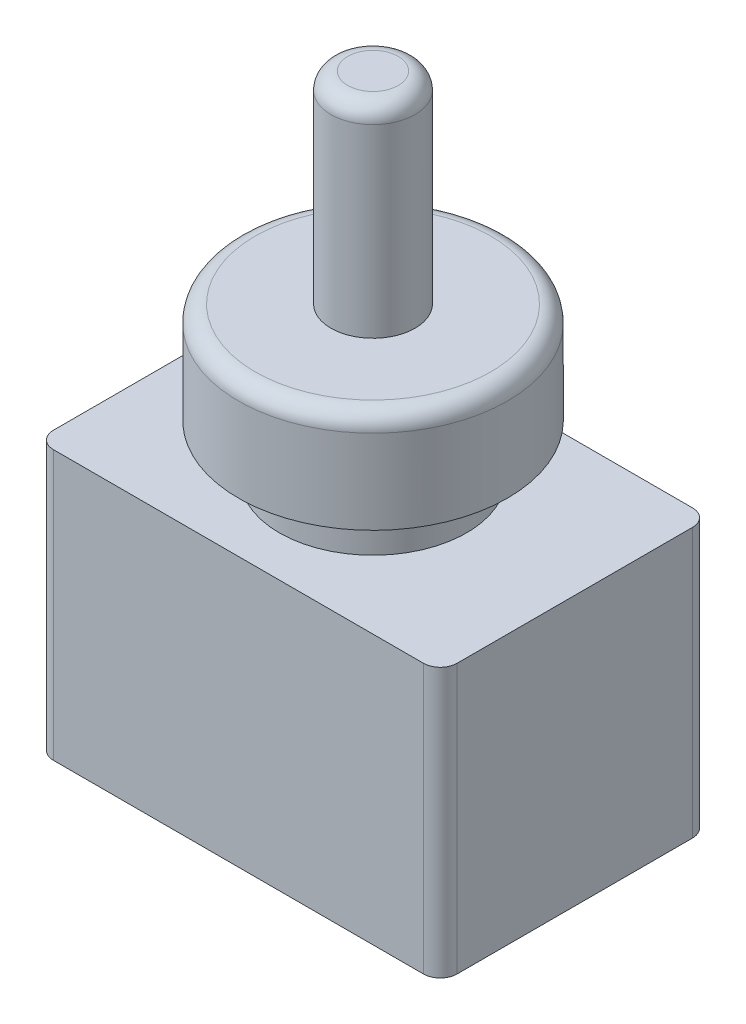
ISO-10303-21;
HEADER;
FILE_DESCRIPTION(('STEP AP214'),'2;1');
FILE_NAME('part.step','',(''),(''),'','','');
FILE_SCHEMA(('AUTOMOTIVE_DESIGN { 1 0 10303 214 1 1 1 1 }'));
ENDSEC;
DATA;
#1=APPLICATION_CONTEXT('core data for automotive mechanical design processes');
#2=APPLICATION_PROTOCOL_DEFINITION('international standard','automotive_design',2000,#1);
#3=PRODUCT_CONTEXT('',#1,'mechanical');
#4=PRODUCT('Part','Part','',(#3));
#5=PRODUCT_RELATED_PRODUCT_CATEGORY('part','',(#4));
#6=PRODUCT_DEFINITION_FORMATION('','',#4);
#7=PRODUCT_DEFINITION_CONTEXT('part definition',#1,'design');
#8=PRODUCT_DEFINITION('design','',#6,#7);
#9=PRODUCT_DEFINITION_SHAPE('','',#8);
#10=(LENGTH_UNIT() NAMED_UNIT(*) SI_UNIT(.MILLI.,.METRE.));
#11=(NAMED_UNIT(*) PLANE_ANGLE_UNIT() SI_UNIT($,.RADIAN.));
#12=(NAMED_UNIT(*) SI_UNIT($,.STERADIAN.) SOLID_ANGLE_UNIT());
#13=UNCERTAINTY_MEASURE_WITH_UNIT(LENGTH_MEASURE(1.E-05),#10,'distance_accuracy_value','');
#14=(GEOMETRIC_REPRESENTATION_CONTEXT(3) GLOBAL_UNCERTAINTY_ASSIGNED_CONTEXT((#13)) GLOBAL_UNIT_ASSIGNED_CONTEXT((#10,
#11,#12)) REPRESENTATION_CONTEXT('',''));
#15=CARTESIAN_POINT('',(0.,0.,0.));
#16=DIRECTION('',(0.,0.,1.));
#17=DIRECTION('',(1.,0.,0.));
#18=AXIS2_PLACEMENT_3D('',#15,#16,#17);
#19=CARTESIAN_POINT('',(12.,16.,8.));
#20=DIRECTION('',(0.,1.,0.));
#21=DIRECTION('',(0.,0.,1.));
#22=AXIS2_PLACEMENT_3D('',#19,#20,#21);
#23=PLANE('',#22);
#24=DIRECTION('',(1.,0.,0.));
#25=VECTOR('',#24,1.);
#26=CARTESIAN_POINT('',(-12.,16.,8.));
#27=LINE('',#26,#25);
#28=CARTESIAN_POINT('',(-11.,16.,8.));
#29=VERTEX_POINT('',#28);
#30=CARTESIAN_POINT('',(11.,16.,8.));
#31=VERTEX_POINT('',#30);
#32=EDGE_CURVE('E137',#29,#31,#27,.T.);
#33=ORIENTED_EDGE('',*,*,#32,.T.);
#34=CARTESIAN_POINT('',(11.,16.,7.));
#35=DIRECTION('',(0.,1.,0.));
#36=DIRECTION('',(0.,0.,1.));
#37=AXIS2_PLACEMENT_3D('',#34,#35,#36);
#38=CIRCLE('',#37,1.);
#39=CARTESIAN_POINT('',(12.,16.,7.));
#40=VERTEX_POINT('',#39);
#41=EDGE_CURVE('E168',#31,#40,#38,.T.);
#42=ORIENTED_EDGE('',*,*,#41,.T.);
#43=DIRECTION('',(0.,0.,-1.));
#44=VECTOR('',#43,1.);
#45=CARTESIAN_POINT('',(12.,16.,-8.));
#46=LINE('',#45,#44);
#47=CARTESIAN_POINT('',(12.,16.,-7.));
#48=VERTEX_POINT('',#47);
#49=EDGE_CURVE('E121',#40,#48,#46,.T.);
#50=ORIENTED_EDGE('',*,*,#49,.T.);
#51=CARTESIAN_POINT('',(11.,16.,-7.));
#52=DIRECTION('',(0.,1.,0.));
#53=DIRECTION('',(0.,0.,1.));
#54=AXIS2_PLACEMENT_3D('',#51,#52,#53);
#55=CIRCLE('',#54,1.);
#56=CARTESIAN_POINT('',(11.,16.,-8.));
#57=VERTEX_POINT('',#56);
#58=EDGE_CURVE('E166',#48,#57,#55,.T.);
#59=ORIENTED_EDGE('',*,*,#58,.T.);
#60=DIRECTION('',(-1.,0.,0.));
#61=VECTOR('',#60,1.);
#62=CARTESIAN_POINT('',(-12.,16.,-8.));
#63=LINE('',#62,#61);
#64=CARTESIAN_POINT('',(-11.,16.,-8.));
#65=VERTEX_POINT('',#64);
#66=EDGE_CURVE('E179',#57,#65,#63,.T.);
#67=ORIENTED_EDGE('',*,*,#66,.T.);
#68=CARTESIAN_POINT('',(-11.,16.,-7.));
#69=DIRECTION('',(0.,1.,0.));
#70=DIRECTION('',(0.,0.,1.));
#71=AXIS2_PLACEMENT_3D('',#68,#69,#70);
#72=CIRCLE('',#71,1.);
#73=CARTESIAN_POINT('',(-12.,16.,-7.));
#74=VERTEX_POINT('',#73);
#75=EDGE_CURVE('E56',#65,#74,#72,.T.);
#76=ORIENTED_EDGE('',*,*,#75,.T.);
#77=DIRECTION('',(0.,0.,1.));
#78=VECTOR('',#77,1.);
#79=CARTESIAN_POINT('',(-12.,16.,-8.));
#80=LINE('',#79,#78);
#81=CARTESIAN_POINT('',(-12.,16.,7.));
#82=VERTEX_POINT('',#81);
#83=EDGE_CURVE('E187',#74,#82,#80,.T.);
#84=ORIENTED_EDGE('',*,*,#83,.T.);
#85=CARTESIAN_POINT('',(-11.,16.,7.));
#86=DIRECTION('',(0.,1.,0.));
#87=DIRECTION('',(0.,0.,1.));
#88=AXIS2_PLACEMENT_3D('',#85,#86,#87);
#89=CIRCLE('',#88,1.);
#90=EDGE_CURVE('E163',#82,#29,#89,.T.);
#91=ORIENTED_EDGE('',*,*,#90,.T.);
#92=EDGE_LOOP('',(#33,#42,#50,#59,#67,#76,#84,#91));
#93=FACE_BOUND('',#92,.T.);
#94=CARTESIAN_POINT('',(0.,16.,0.));
#95=DIRECTION('',(0.,1.,0.));
#96=DIRECTION('',(0.,0.,1.));
#97=AXIS2_PLACEMENT_3D('',#94,#95,#96);
#98=CIRCLE('',#97,5.57185663947555);
#99=CARTESIAN_POINT('',(0.,16.,5.57185663947555));
#100=VERTEX_POINT('',#99);
#101=EDGE_CURVE('E134',#100,#100,#98,.T.);
#102=ORIENTED_EDGE('',*,*,#101,.F.);
#103=EDGE_LOOP('',(#102));
#104=FACE_BOUND('',#103,.T.);
#105=ADVANCED_FACE('F35',(#93,#104),#23,.T.);
#106=CARTESIAN_POINT('',(12.,16.,-8.));
#107=DIRECTION('',(-1.,0.,0.));
#108=DIRECTION('',(0.,0.,1.));
#109=AXIS2_PLACEMENT_3D('',#106,#107,#108);
#110=PLANE('',#109);
#111=ORIENTED_EDGE('',*,*,#49,.F.);
#112=DIRECTION('',(0.,-1.,0.));
#113=VECTOR('',#112,1.);
#114=CARTESIAN_POINT('',(12.,16.,7.));
#115=LINE('',#114,#113);
#116=CARTESIAN_POINT('',(12.,0.,7.));
#117=VERTEX_POINT('',#116);
#118=EDGE_CURVE('E105',#40,#117,#115,.T.);
#119=ORIENTED_EDGE('',*,*,#118,.T.);
#120=DIRECTION('',(0.,0.,-1.));
#121=VECTOR('',#120,1.);
#122=CARTESIAN_POINT('',(12.,0.,-8.));
#123=LINE('',#122,#121);
#124=CARTESIAN_POINT('',(12.,0.,-7.));
#125=VERTEX_POINT('',#124);
#126=EDGE_CURVE('E118',#117,#125,#123,.T.);
#127=ORIENTED_EDGE('',*,*,#126,.T.);
#128=DIRECTION('',(0.,-1.,0.));
#129=VECTOR('',#128,1.);
#130=CARTESIAN_POINT('',(12.,16.,-7.));
#131=LINE('',#130,#129);
#132=EDGE_CURVE('E123',#125,#48,#131,.F.);
#133=ORIENTED_EDGE('',*,*,#132,.T.);
#134=EDGE_LOOP('',(#111,#119,#127,#133));
#135=FACE_BOUND('',#134,.T.);
#136=ADVANCED_FACE('F117',(#135),#110,.F.);
#137=CARTESIAN_POINT('',(-12.,16.,-8.));
#138=DIRECTION('',(0.,0.,1.));
#139=DIRECTION('',(1.,0.,0.));
#140=AXIS2_PLACEMENT_3D('',#137,#138,#139);
#141=PLANE('',#140);
#142=ORIENTED_EDGE('',*,*,#66,.F.);
#143=DIRECTION('',(0.,-1.,0.));
#144=VECTOR('',#143,1.);
#145=CARTESIAN_POINT('',(11.,16.,-8.));
#146=LINE('',#145,#144);
#147=CARTESIAN_POINT('',(11.,0.,-8.));
#148=VERTEX_POINT('',#147);
#149=EDGE_CURVE('E172',#57,#148,#146,.T.);
#150=ORIENTED_EDGE('',*,*,#149,.T.);
#151=DIRECTION('',(-1.,0.,0.));
#152=VECTOR('',#151,1.);
#153=CARTESIAN_POINT('',(-12.,0.,-8.));
#154=LINE('',#153,#152);
#155=CARTESIAN_POINT('',(-11.,0.,-8.));
#156=VERTEX_POINT('',#155);
#157=EDGE_CURVE('E127',#148,#156,#154,.T.);
#158=ORIENTED_EDGE('',*,*,#157,.T.);
#159=DIRECTION('',(0.,-1.,0.));
#160=VECTOR('',#159,1.);
#161=CARTESIAN_POINT('',(-11.,16.,-8.));
#162=LINE('',#161,#160);
#163=EDGE_CURVE('E170',#156,#65,#162,.F.);
#164=ORIENTED_EDGE('',*,*,#163,.T.);
#165=EDGE_LOOP('',(#142,#150,#158,#164));
#166=FACE_BOUND('',#165,.T.);
#167=ADVANCED_FACE('F177',(#166),#141,.F.);
#168=CARTESIAN_POINT('',(-12.,16.,-8.));
#169=DIRECTION('',(1.,0.,0.));
#170=DIRECTION('',(0.,0.,-1.));
#171=AXIS2_PLACEMENT_3D('',#168,#169,#170);
#172=PLANE('',#171);
#173=ORIENTED_EDGE('',*,*,#83,.F.);
#174=DIRECTION('',(0.,-1.,0.));
#175=VECTOR('',#174,1.);
#176=CARTESIAN_POINT('',(-12.,16.,-7.));
#177=LINE('',#176,#175);
#178=CARTESIAN_POINT('',(-12.,0.,-7.));
#179=VERTEX_POINT('',#178);
#180=EDGE_CURVE('E11',#74,#179,#177,.T.);
#181=ORIENTED_EDGE('',*,*,#180,.T.);
#182=DIRECTION('',(0.,0.,1.));
#183=VECTOR('',#182,1.);
#184=CARTESIAN_POINT('',(-12.,0.,-8.));
#185=LINE('',#184,#183);
#186=CARTESIAN_POINT('',(-12.,0.,7.));
#187=VERTEX_POINT('',#186);
#188=EDGE_CURVE('E131',#179,#187,#185,.T.);
#189=ORIENTED_EDGE('',*,*,#188,.T.);
#190=DIRECTION('',(0.,-1.,0.));
#191=VECTOR('',#190,1.);
#192=CARTESIAN_POINT('',(-12.,16.,7.));
#193=LINE('',#192,#191);
#194=EDGE_CURVE('E43',#187,#82,#193,.F.);
#195=ORIENTED_EDGE('',*,*,#194,.T.);
#196=EDGE_LOOP('',(#173,#181,#189,#195));
#197=FACE_BOUND('',#196,.T.);
#198=ADVANCED_FACE('F186',(#197),#172,.F.);
#199=CARTESIAN_POINT('',(-12.,16.,8.));
#200=DIRECTION('',(0.,0.,-1.));
#201=DIRECTION('',(-1.,0.,0.));
#202=AXIS2_PLACEMENT_3D('',#199,#200,#201);
#203=PLANE('',#202);
#204=DIRECTION('',(1.,0.,0.));
#205=VECTOR('',#204,1.);
#206=CARTESIAN_POINT('',(-12.,0.,8.));
#207=LINE('',#206,#205);
#208=CARTESIAN_POINT('',(-11.,0.,8.));
#209=VERTEX_POINT('',#208);
#210=CARTESIAN_POINT('',(11.,0.,8.));
#211=VERTEX_POINT('',#210);
#212=EDGE_CURVE('E141',#209,#211,#207,.T.);
#213=ORIENTED_EDGE('',*,*,#212,.T.);
#214=DIRECTION('',(0.,-1.,0.));
#215=VECTOR('',#214,1.);
#216=CARTESIAN_POINT('',(11.,16.,8.));
#217=LINE('',#216,#215);
#218=EDGE_CURVE('E106',#211,#31,#217,.F.);
#219=ORIENTED_EDGE('',*,*,#218,.T.);
#220=ORIENTED_EDGE('',*,*,#32,.F.);
#221=DIRECTION('',(0.,-1.,0.));
#222=VECTOR('',#221,1.);
#223=CARTESIAN_POINT('',(-11.,16.,8.));
#224=LINE('',#223,#222);
#225=EDGE_CURVE('E111',#29,#209,#224,.T.);
#226=ORIENTED_EDGE('',*,*,#225,.T.);
#227=EDGE_LOOP('',(#213,#219,#220,#226));
#228=FACE_BOUND('',#227,.T.);
#229=ADVANCED_FACE('F232',(#228),#203,.F.);
#230=CARTESIAN_POINT('',(12.,0.,8.));
#231=DIRECTION('',(0.,1.,0.));
#232=DIRECTION('',(0.,0.,1.));
#233=AXIS2_PLACEMENT_3D('',#230,#231,#232);
#234=PLANE('',#233);
#235=ORIENTED_EDGE('',*,*,#126,.F.);
#236=CARTESIAN_POINT('',(11.,0.,7.));
#237=DIRECTION('',(0.,1.,0.));
#238=DIRECTION('',(0.,0.,1.));
#239=AXIS2_PLACEMENT_3D('',#236,#237,#238);
#240=CIRCLE('',#239,1.);
#241=EDGE_CURVE('E101',#117,#211,#240,.F.);
#242=ORIENTED_EDGE('',*,*,#241,.T.);
#243=ORIENTED_EDGE('',*,*,#212,.F.);
#244=CARTESIAN_POINT('',(-11.,0.,7.));
#245=DIRECTION('',(0.,1.,0.));
#246=DIRECTION('',(0.,0.,1.));
#247=AXIS2_PLACEMENT_3D('',#244,#245,#246);
#248=CIRCLE('',#247,1.);
#249=EDGE_CURVE('E122',#209,#187,#248,.F.);
#250=ORIENTED_EDGE('',*,*,#249,.T.);
#251=ORIENTED_EDGE('',*,*,#188,.F.);
#252=CARTESIAN_POINT('',(-11.,0.,-7.));
#253=DIRECTION('',(0.,1.,0.));
#254=DIRECTION('',(0.,0.,1.));
#255=AXIS2_PLACEMENT_3D('',#252,#253,#254);
#256=CIRCLE('',#255,1.);
#257=EDGE_CURVE('E157',#179,#156,#256,.F.);
#258=ORIENTED_EDGE('',*,*,#257,.T.);
#259=ORIENTED_EDGE('',*,*,#157,.F.);
#260=CARTESIAN_POINT('',(11.,0.,-7.));
#261=DIRECTION('',(0.,1.,0.));
#262=DIRECTION('',(0.,0.,1.));
#263=AXIS2_PLACEMENT_3D('',#260,#261,#262);
#264=CIRCLE('',#263,1.);
#265=EDGE_CURVE('E112',#148,#125,#264,.F.);
#266=ORIENTED_EDGE('',*,*,#265,.T.);
#267=EDGE_LOOP('',(#235,#242,#243,#250,#251,#258,#259,#266));
#268=FACE_BOUND('',#267,.T.);
#269=ADVANCED_FACE('F125',(#268),#234,.F.);
#270=CARTESIAN_POINT('',(0.,19.,0.));
#271=DIRECTION('',(0.,-1.,0.));
#272=DIRECTION('',(0.,0.,-1.));
#273=AXIS2_PLACEMENT_3D('',#270,#271,#272);
#274=CYLINDRICAL_SURFACE('',#273,5.57185663947555);
#275=CARTESIAN_POINT('',(0.,19.,0.));
#276=DIRECTION('',(0.,1.,0.));
#277=DIRECTION('',(0.,0.,1.));
#278=AXIS2_PLACEMENT_3D('',#275,#276,#277);
#279=CIRCLE('',#278,5.57185663947555);
#280=CARTESIAN_POINT('',(0.,19.,5.57185663947555));
#281=VERTEX_POINT('',#280);
#282=EDGE_CURVE('E128',#281,#281,#279,.T.);
#283=ORIENTED_EDGE('',*,*,#282,.F.);
#284=EDGE_LOOP('',(#283));
#285=FACE_BOUND('',#284,.T.);
#286=ORIENTED_EDGE('',*,*,#101,.T.);
#287=EDGE_LOOP('',(#286));
#288=FACE_BOUND('',#287,.T.);
#289=ADVANCED_FACE('F228',(#285,#288),#274,.T.);
#290=CARTESIAN_POINT('',(0.,19.,0.));
#291=DIRECTION('',(0.,-1.,0.));
#292=DIRECTION('',(1.,0.,0.));
#293=AXIS2_PLACEMENT_3D('',#290,#291,#292);
#294=PLANE('',#293);
#295=CARTESIAN_POINT('',(0.,19.,0.));
#296=DIRECTION('',(0.,-1.,0.));
#297=DIRECTION('',(1.,0.,0.));
#298=AXIS2_PLACEMENT_3D('',#295,#296,#297);
#299=CIRCLE('',#298,8.);
#300=CARTESIAN_POINT('',(8.,19.,0.));
#301=VERTEX_POINT('',#300);
#302=EDGE_CURVE('E194',#301,#301,#299,.T.);
#303=ORIENTED_EDGE('',*,*,#302,.T.);
#304=EDGE_LOOP('',(#303));
#305=FACE_BOUND('',#304,.T.);
#306=ORIENTED_EDGE('',*,*,#282,.T.);
#307=EDGE_LOOP('',(#306));
#308=FACE_BOUND('',#307,.T.);
#309=ADVANCED_FACE('F349',(#305,#308),#294,.T.);
#310=CARTESIAN_POINT('',(0.,0.,0.));
#311=DIRECTION('',(0.,-1.,0.));
#312=DIRECTION('',(1.,0.,0.));
#313=AXIS2_PLACEMENT_3D('',#310,#311,#312);
#314=CYLINDRICAL_SURFACE('',#313,8.);
#315=CARTESIAN_POINT('',(0.,24.,0.));
#316=DIRECTION('',(0.,1.,0.));
#317=DIRECTION('',(-1.,0.,0.));
#318=AXIS2_PLACEMENT_3D('',#315,#316,#317);
#319=CIRCLE('',#318,8.);
#320=CARTESIAN_POINT('',(-8.,24.,0.));
#321=VERTEX_POINT('',#320);
#322=EDGE_CURVE('E143',#321,#321,#319,.F.);
#323=ORIENTED_EDGE('',*,*,#322,.T.);
#324=EDGE_LOOP('',(#323));
#325=FACE_BOUND('',#324,.T.);
#326=ORIENTED_EDGE('',*,*,#302,.F.);
#327=EDGE_LOOP('',(#326));
#328=FACE_BOUND('',#327,.T.);
#329=ADVANCED_FACE('F216',(#325,#328),#314,.T.);
#330=CARTESIAN_POINT('',(8.,25.,0.));
#331=DIRECTION('',(0.,1.,0.));
#332=DIRECTION('',(-1.,0.,0.));
#333=AXIS2_PLACEMENT_3D('',#330,#331,#332);
#334=PLANE('',#333);
#335=CARTESIAN_POINT('',(0.,25.,0.));
#336=DIRECTION('',(0.,1.,0.));
#337=DIRECTION('',(-1.,0.,0.));
#338=AXIS2_PLACEMENT_3D('',#335,#336,#337);
#339=CIRCLE('',#338,7.);
#340=CARTESIAN_POINT('',(-7.,25.,0.));
#341=VERTEX_POINT('',#340);
#342=EDGE_CURVE('E146',#341,#341,#339,.T.);
#343=ORIENTED_EDGE('',*,*,#342,.T.);
#344=EDGE_LOOP('',(#343));
#345=FACE_BOUND('',#344,.T.);
#346=CARTESIAN_POINT('',(0.,25.,0.));
#347=DIRECTION('',(0.,-1.,0.));
#348=DIRECTION('',(1.,0.,0.));
#349=AXIS2_PLACEMENT_3D('',#346,#347,#348);
#350=CIRCLE('',#349,2.5);
#351=CARTESIAN_POINT('',(2.5,25.,0.));
#352=VERTEX_POINT('',#351);
#353=EDGE_CURVE('E198',#352,#352,#350,.T.);
#354=ORIENTED_EDGE('',*,*,#353,.T.);
#355=EDGE_LOOP('',(#354));
#356=FACE_BOUND('',#355,.T.);
#357=ADVANCED_FACE('F202',(#345,#356),#334,.T.);
#358=CARTESIAN_POINT('',(0.,0.,0.));
#359=DIRECTION('',(0.,-1.,0.));
#360=DIRECTION('',(1.,0.,0.));
#361=AXIS2_PLACEMENT_3D('',#358,#359,#360);
#362=CYLINDRICAL_SURFACE('',#361,2.5);
#363=CARTESIAN_POINT('',(0.,36.,0.));
#364=DIRECTION('',(0.,1.,0.));
#365=DIRECTION('',(-1.,0.,0.));
#366=AXIS2_PLACEMENT_3D('',#363,#364,#365);
#367=CIRCLE('',#366,2.5);
#368=CARTESIAN_POINT('',(-2.5,36.,0.));
#369=VERTEX_POINT('',#368);
#370=EDGE_CURVE('E149',#369,#369,#367,.F.);
#371=ORIENTED_EDGE('',*,*,#370,.T.);
#372=EDGE_LOOP('',(#371));
#373=FACE_BOUND('',#372,.T.);
#374=ORIENTED_EDGE('',*,*,#353,.F.);
#375=EDGE_LOOP('',(#374));
#376=FACE_BOUND('',#375,.T.);
#377=ADVANCED_FACE('F204',(#373,#376),#362,.T.);
#378=CARTESIAN_POINT('',(2.5,37.,0.));
#379=DIRECTION('',(0.,1.,0.));
#380=DIRECTION('',(-1.,0.,0.));
#381=AXIS2_PLACEMENT_3D('',#378,#379,#380);
#382=PLANE('',#381);
#383=CARTESIAN_POINT('',(0.,37.,0.));
#384=DIRECTION('',(0.,1.,0.));
#385=DIRECTION('',(-1.,0.,0.));
#386=AXIS2_PLACEMENT_3D('',#383,#384,#385);
#387=CIRCLE('',#386,1.5);
#388=CARTESIAN_POINT('',(-1.5,37.,0.));
#389=VERTEX_POINT('',#388);
#390=EDGE_CURVE('E152',#389,#389,#387,.T.);
#391=ORIENTED_EDGE('',*,*,#390,.T.);
#392=EDGE_LOOP('',(#391));
#393=FACE_BOUND('',#392,.T.);
#394=ADVANCED_FACE('F206',(#393),#382,.T.);
#395=CARTESIAN_POINT('',(0.,24.,0.));
#396=DIRECTION('',(0.,1.,0.));
#397=DIRECTION('',(-1.,0.,0.));
#398=AXIS2_PLACEMENT_3D('',#395,#396,#397);
#399=TOROIDAL_SURFACE('',#398,7.,1.);
#400=ORIENTED_EDGE('',*,*,#342,.F.);
#401=EDGE_LOOP('',(#400));
#402=FACE_BOUND('',#401,.T.);
#403=ORIENTED_EDGE('',*,*,#322,.F.);
#404=EDGE_LOOP('',(#403));
#405=FACE_BOUND('',#404,.T.);
#406=ADVANCED_FACE('F213',(#402,#405),#399,.T.);
#407=CARTESIAN_POINT('',(0.,36.,0.));
#408=DIRECTION('',(0.,1.,0.));
#409=DIRECTION('',(-1.,0.,0.));
#410=AXIS2_PLACEMENT_3D('',#407,#408,#409);
#411=TOROIDAL_SURFACE('',#410,1.5,1.);
#412=ORIENTED_EDGE('',*,*,#390,.F.);
#413=EDGE_LOOP('',(#412));
#414=FACE_BOUND('',#413,.T.);
#415=ORIENTED_EDGE('',*,*,#370,.F.);
#416=EDGE_LOOP('',(#415));
#417=FACE_BOUND('',#416,.T.);
#418=ADVANCED_FACE('F242',(#414,#417),#411,.T.);
#419=CARTESIAN_POINT('',(11.,16.,7.));
#420=DIRECTION('',(0.,-1.,0.));
#421=DIRECTION('',(0.,0.,-1.));
#422=AXIS2_PLACEMENT_3D('',#419,#420,#421);
#423=CYLINDRICAL_SURFACE('',#422,1.);
#424=ORIENTED_EDGE('',*,*,#41,.F.);
#425=ORIENTED_EDGE('',*,*,#218,.F.);
#426=ORIENTED_EDGE('',*,*,#241,.F.);
#427=ORIENTED_EDGE('',*,*,#118,.F.);
#428=EDGE_LOOP('',(#424,#425,#426,#427));
#429=FACE_BOUND('',#428,.T.);
#430=ADVANCED_FACE('F104',(#429),#423,.T.);
#431=CARTESIAN_POINT('',(11.,16.,-7.));
#432=DIRECTION('',(0.,-1.,0.));
#433=DIRECTION('',(0.,0.,-1.));
#434=AXIS2_PLACEMENT_3D('',#431,#432,#433);
#435=CYLINDRICAL_SURFACE('',#434,1.);
#436=ORIENTED_EDGE('',*,*,#58,.F.);
#437=ORIENTED_EDGE('',*,*,#132,.F.);
#438=ORIENTED_EDGE('',*,*,#265,.F.);
#439=ORIENTED_EDGE('',*,*,#149,.F.);
#440=EDGE_LOOP('',(#436,#437,#438,#439));
#441=FACE_BOUND('',#440,.T.);
#442=ADVANCED_FACE('F249',(#441),#435,.T.);
#443=CARTESIAN_POINT('',(-11.,16.,-7.));
#444=DIRECTION('',(0.,-1.,0.));
#445=DIRECTION('',(0.,0.,-1.));
#446=AXIS2_PLACEMENT_3D('',#443,#444,#445);
#447=CYLINDRICAL_SURFACE('',#446,1.);
#448=ORIENTED_EDGE('',*,*,#75,.F.);
#449=ORIENTED_EDGE('',*,*,#163,.F.);
#450=ORIENTED_EDGE('',*,*,#257,.F.);
#451=ORIENTED_EDGE('',*,*,#180,.F.);
#452=EDGE_LOOP('',(#448,#449,#450,#451));
#453=FACE_BOUND('',#452,.T.);
#454=ADVANCED_FACE('F185',(#453),#447,.T.);
#455=CARTESIAN_POINT('',(-11.,16.,7.));
#456=DIRECTION('',(0.,-1.,0.));
#457=DIRECTION('',(0.,0.,-1.));
#458=AXIS2_PLACEMENT_3D('',#455,#456,#457);
#459=CYLINDRICAL_SURFACE('',#458,1.);
#460=ORIENTED_EDGE('',*,*,#90,.F.);
#461=ORIENTED_EDGE('',*,*,#194,.F.);
#462=ORIENTED_EDGE('',*,*,#249,.F.);
#463=ORIENTED_EDGE('',*,*,#225,.F.);
#464=EDGE_LOOP('',(#460,#461,#462,#463));
#465=FACE_BOUND('',#464,.T.);
#466=ADVANCED_FACE('F37',(#465),#459,.T.);
#467=CLOSED_SHELL('',(#105,#136,#167,#198,#229,#269,#289,#309,#329,#357,#377,#394,#406,#418,
#430,#442,#454,#466));
#468=MANIFOLD_SOLID_BREP('B2',#467);
#469=ADVANCED_BREP_SHAPE_REPRESENTATION('',(#18,#468),#14);
#470=SHAPE_DEFINITION_REPRESENTATION(#9,#469);
ENDSEC;
END-ISO-10303-21;
